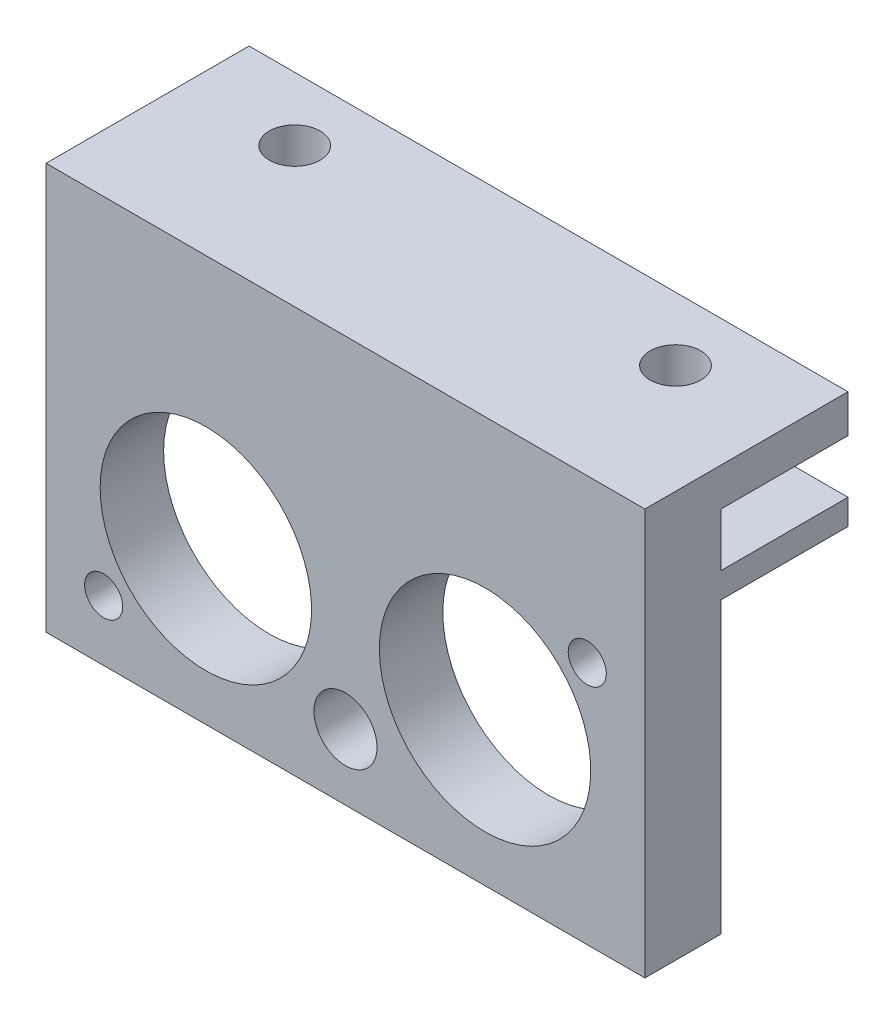
ISO-10303-21;
HEADER;
FILE_DESCRIPTION(('STEP AP214'),'2;1');
FILE_NAME('part.step','',(''),(''),'','','');
FILE_SCHEMA(('AUTOMOTIVE_DESIGN { 1 0 10303 214 1 1 1 1 }'));
ENDSEC;
DATA;
#1=APPLICATION_CONTEXT('core data for automotive mechanical design processes');
#2=APPLICATION_PROTOCOL_DEFINITION('international standard','automotive_design',2000,#1);
#3=PRODUCT_CONTEXT('',#1,'mechanical');
#4=PRODUCT('Part','Part','',(#3));
#5=PRODUCT_RELATED_PRODUCT_CATEGORY('part','',(#4));
#6=PRODUCT_DEFINITION_FORMATION('','',#4);
#7=PRODUCT_DEFINITION_CONTEXT('part definition',#1,'design');
#8=PRODUCT_DEFINITION('design','',#6,#7);
#9=PRODUCT_DEFINITION_SHAPE('','',#8);
#10=(LENGTH_UNIT() NAMED_UNIT(*) SI_UNIT(.MILLI.,.METRE.));
#11=(NAMED_UNIT(*) PLANE_ANGLE_UNIT() SI_UNIT($,.RADIAN.));
#12=(NAMED_UNIT(*) SI_UNIT($,.STERADIAN.) SOLID_ANGLE_UNIT());
#13=UNCERTAINTY_MEASURE_WITH_UNIT(LENGTH_MEASURE(1.E-05),#10,'distance_accuracy_value','');
#14=(GEOMETRIC_REPRESENTATION_CONTEXT(3) GLOBAL_UNCERTAINTY_ASSIGNED_CONTEXT((#13)) GLOBAL_UNIT_ASSIGNED_CONTEXT((#10,
#11,#12)) REPRESENTATION_CONTEXT('',''));
#15=CARTESIAN_POINT('',(0.,0.,0.));
#16=DIRECTION('',(0.,0.,1.));
#17=DIRECTION('',(1.,0.,0.));
#18=AXIS2_PLACEMENT_3D('',#15,#16,#17);
#19=CARTESIAN_POINT('',(-86.1189313630636,-26.6187031008466,2.482219341433E-13));
#20=DIRECTION('',(0.,0.,1.));
#21=DIRECTION('',(1.,0.,0.));
#22=AXIS2_PLACEMENT_3D('',#19,#20,#21);
#23=PLANE('',#22);
#24=DIRECTION('',(1.,0.,0.));
#25=VECTOR('',#24,1.);
#26=CARTESIAN_POINT('',(-88.1189313630636,-3.81870310084656,0.));
#27=LINE('',#26,#25);
#28=CARTESIAN_POINT('',(-54.5289313630636,-3.81870310084656,0.));
#29=VERTEX_POINT('',#28);
#30=CARTESIAN_POINT('',(-40.9389313630636,-3.81870310084656,2.48666185319545E-13));
#31=VERTEX_POINT('',#30);
#32=EDGE_CURVE('E365',#29,#31,#27,.T.);
#33=ORIENTED_EDGE('',*,*,#32,.F.);
#34=DIRECTION('',(0.,1.,0.));
#35=VECTOR('',#34,1.);
#36=CARTESIAN_POINT('',(-54.5289313630636,-26.6187031008466,2.482219341433E-13));
#37=LINE('',#36,#35);
#38=CARTESIAN_POINT('',(-54.5289313630636,0.381296899153442,0.));
#39=VERTEX_POINT('',#38);
#40=EDGE_CURVE('E460',#29,#39,#37,.T.);
#41=ORIENTED_EDGE('',*,*,#40,.T.);
#42=DIRECTION('',(-1.,0.,0.));
#43=VECTOR('',#42,1.);
#44=CARTESIAN_POINT('',(-40.9389313630636,0.381296899153443,0.));
#45=LINE('',#44,#43);
#46=CARTESIAN_POINT('',(-40.9389313630636,0.381296899153442,2.48666185319545E-13));
#47=VERTEX_POINT('',#46);
#48=EDGE_CURVE('E385',#47,#39,#45,.T.);
#49=ORIENTED_EDGE('',*,*,#48,.F.);
#50=DIRECTION('',(0.,-1.,0.));
#51=VECTOR('',#50,1.);
#52=CARTESIAN_POINT('',(-40.9389313630636,-28.6187031008466,2.48666185319545E-13));
#53=LINE('',#52,#51);
#54=EDGE_CURVE('E310',#47,#31,#53,.T.);
#55=ORIENTED_EDGE('',*,*,#54,.T.);
#56=EDGE_LOOP('',(#33,#41,#49,#55));
#57=FACE_BOUND('',#56,.T.);
#58=ADVANCED_FACE('F33',(#57),#23,.F.);
#59=CARTESIAN_POINT('',(-86.3189313630636,-6.41870310084656,-48.1183582429822));
#60=DIRECTION('',(0.,-1.,0.));
#61=DIRECTION('',(0.,0.,-1.));
#62=AXIS2_PLACEMENT_3D('',#59,#60,#61);
#63=PLANE('',#62);
#64=DIRECTION('',(0.,0.,1.));
#65=VECTOR('',#64,1.);
#66=CARTESIAN_POINT('',(-54.5289313630636,-6.41870310084656,1.00000000000025));
#67=LINE('',#66,#65);
#68=CARTESIAN_POINT('',(-54.5289313630636,-6.41870310084656,2.4980018054066E-13));
#69=VERTEX_POINT('',#68);
#70=CARTESIAN_POINT('',(-54.5289313630636,-6.41870310084656,1.00000000000025));
#71=VERTEX_POINT('',#70);
#72=EDGE_CURVE('E208',#69,#71,#67,.T.);
#73=ORIENTED_EDGE('',*,*,#72,.F.);
#74=DIRECTION('',(-1.,0.,0.));
#75=VECTOR('',#74,1.);
#76=CARTESIAN_POINT('',(-86.3189313630636,-6.41870310084656,2.48666185319545E-13));
#77=LINE('',#76,#75);
#78=CARTESIAN_POINT('',(-42.7389313630636,-6.41870310084656,2.48666185319545E-13));
#79=VERTEX_POINT('',#78);
#80=EDGE_CURVE('E410',#79,#69,#77,.T.);
#81=ORIENTED_EDGE('',*,*,#80,.F.);
#82=DIRECTION('',(0.,0.,1.));
#83=VECTOR('',#82,1.);
#84=CARTESIAN_POINT('',(-42.7389313630636,-6.41870310084656,-48.1183582429822));
#85=LINE('',#84,#83);
#86=CARTESIAN_POINT('',(-42.7389313630636,-6.41870310084656,1.00000000000025));
#87=VERTEX_POINT('',#86);
#88=EDGE_CURVE('E233',#79,#87,#85,.T.);
#89=ORIENTED_EDGE('',*,*,#88,.T.);
#90=DIRECTION('',(1.,0.,0.));
#91=VECTOR('',#90,1.);
#92=CARTESIAN_POINT('',(-86.3189313630636,-6.41870310084656,1.00000000000025));
#93=LINE('',#92,#91);
#94=EDGE_CURVE('E225',#71,#87,#93,.T.);
#95=ORIENTED_EDGE('',*,*,#94,.F.);
#96=EDGE_LOOP('',(#73,#81,#89,#95));
#97=FACE_BOUND('',#96,.T.);
#98=ADVANCED_FACE('F231',(#97),#63,.T.);
#99=CARTESIAN_POINT('',(-88.1189313630636,-3.81870310084656,-10.));
#100=DIRECTION('',(0.,-1.,0.));
#101=DIRECTION('',(1.,0.,0.));
#102=AXIS2_PLACEMENT_3D('',#99,#100,#101);
#103=PLANE('',#102);
#104=CARTESIAN_POINT('',(-49.5289313630636,-3.81870310084656,-4.99999999999999));
#105=DIRECTION('',(0.,-1.,0.));
#106=DIRECTION('',(1.,0.,0.));
#107=AXIS2_PLACEMENT_3D('',#104,#105,#106);
#108=CIRCLE('',#107,2.);
#109=CARTESIAN_POINT('',(-47.5289313630636,-3.81870310084656,-4.99999999999999));
#110=VERTEX_POINT('',#109);
#111=EDGE_CURVE('E479',#110,#110,#108,.T.);
#112=ORIENTED_EDGE('',*,*,#111,.T.);
#113=EDGE_LOOP('',(#112));
#114=FACE_BOUND('',#113,.T.);
#115=DIRECTION('',(1.,0.,0.));
#116=VECTOR('',#115,1.);
#117=CARTESIAN_POINT('',(-88.1189313630636,-3.81870310084656,-10.));
#118=LINE('',#117,#116);
#119=CARTESIAN_POINT('',(-54.5289313630636,-3.81870310084655,-9.99999999999999));
#120=VERTEX_POINT('',#119);
#121=CARTESIAN_POINT('',(-40.9389313630636,-3.81870310084656,-10.));
#122=VERTEX_POINT('',#121);
#123=EDGE_CURVE('E487',#120,#122,#118,.T.);
#124=ORIENTED_EDGE('',*,*,#123,.F.);
#125=DIRECTION('',(0.,0.,1.));
#126=VECTOR('',#125,1.);
#127=CARTESIAN_POINT('',(-54.5289313630636,-3.81870310084656,-10.));
#128=LINE('',#127,#126);
#129=EDGE_CURVE('E457',#120,#29,#128,.T.);
#130=ORIENTED_EDGE('',*,*,#129,.T.);
#131=ORIENTED_EDGE('',*,*,#32,.T.);
#132=DIRECTION('',(0.,0.,1.));
#133=VECTOR('',#132,1.);
#134=CARTESIAN_POINT('',(-40.9389313630636,-3.81870310084656,-10.));
#135=LINE('',#134,#133);
#136=EDGE_CURVE('E374',#122,#31,#135,.T.);
#137=ORIENTED_EDGE('',*,*,#136,.F.);
#138=EDGE_LOOP('',(#124,#130,#131,#137));
#139=FACE_BOUND('',#138,.T.);
#140=ADVANCED_FACE('F495',(#114,#139),#103,.F.);
#141=CARTESIAN_POINT('',(-88.1189313630636,-5.81870310084656,-10.));
#142=DIRECTION('',(0.,1.,0.));
#143=DIRECTION('',(-1.,0.,0.));
#144=AXIS2_PLACEMENT_3D('',#141,#142,#143);
#145=PLANE('',#144);
#146=CARTESIAN_POINT('',(-49.5289313630636,-5.81870310084656,-4.99999999999999));
#147=DIRECTION('',(0.,-1.,0.));
#148=DIRECTION('',(1.,0.,0.));
#149=AXIS2_PLACEMENT_3D('',#146,#147,#148);
#150=CIRCLE('',#149,2.);
#151=CARTESIAN_POINT('',(-47.5289313630636,-5.81870310084656,-4.99999999999999));
#152=VERTEX_POINT('',#151);
#153=EDGE_CURVE('E475',#152,#152,#150,.T.);
#154=ORIENTED_EDGE('',*,*,#153,.F.);
#155=EDGE_LOOP('',(#154));
#156=FACE_BOUND('',#155,.T.);
#157=DIRECTION('',(-1.,0.,0.));
#158=VECTOR('',#157,1.);
#159=CARTESIAN_POINT('',(-88.1189313630636,-5.81870310084656,0.));
#160=LINE('',#159,#158);
#161=CARTESIAN_POINT('',(-40.9389313630636,-5.81870310084656,0.));
#162=VERTEX_POINT('',#161);
#163=CARTESIAN_POINT('',(-54.5289313630636,-5.81870310084656,0.));
#164=VERTEX_POINT('',#163);
#165=EDGE_CURVE('E366',#162,#164,#160,.T.);
#166=ORIENTED_EDGE('',*,*,#165,.T.);
#167=DIRECTION('',(0.,0.,-1.));
#168=VECTOR('',#167,1.);
#169=CARTESIAN_POINT('',(-54.5289313630636,-5.81870310084656,-10.));
#170=LINE('',#169,#168);
#171=CARTESIAN_POINT('',(-54.5289313630636,-5.81870310084655,-9.99999999999999));
#172=VERTEX_POINT('',#171);
#173=EDGE_CURVE('E453',#164,#172,#170,.T.);
#174=ORIENTED_EDGE('',*,*,#173,.T.);
#175=DIRECTION('',(-1.,0.,0.));
#176=VECTOR('',#175,1.);
#177=CARTESIAN_POINT('',(-88.1189313630636,-5.81870310084656,-10.));
#178=LINE('',#177,#176);
#179=CARTESIAN_POINT('',(-40.9389313630636,-5.81870310084656,-10.));
#180=VERTEX_POINT('',#179);
#181=EDGE_CURVE('E356',#180,#172,#178,.T.);
#182=ORIENTED_EDGE('',*,*,#181,.F.);
#183=DIRECTION('',(0.,0.,1.));
#184=VECTOR('',#183,1.);
#185=CARTESIAN_POINT('',(-40.9389313630636,-5.81870310084656,-10.));
#186=LINE('',#185,#184);
#187=EDGE_CURVE('E371',#180,#162,#186,.T.);
#188=ORIENTED_EDGE('',*,*,#187,.T.);
#189=EDGE_LOOP('',(#166,#174,#182,#188));
#190=FACE_BOUND('',#189,.T.);
#191=ADVANCED_FACE('F504',(#156,#190),#145,.F.);
#192=CARTESIAN_POINT('',(0.,0.,-10.));
#193=DIRECTION('',(0.,0.,1.));
#194=DIRECTION('',(1.,0.,0.));
#195=AXIS2_PLACEMENT_3D('',#192,#193,#194);
#196=PLANE('',#195);
#197=ORIENTED_EDGE('',*,*,#181,.T.);
#198=DIRECTION('',(0.,1.,0.));
#199=VECTOR('',#198,1.);
#200=CARTESIAN_POINT('',(-54.5289313630636,0.,-10.));
#201=LINE('',#200,#199);
#202=EDGE_CURVE('E11',#172,#120,#201,.T.);
#203=ORIENTED_EDGE('',*,*,#202,.T.);
#204=ORIENTED_EDGE('',*,*,#123,.T.);
#205=DIRECTION('',(0.,-1.,0.));
#206=VECTOR('',#205,1.);
#207=CARTESIAN_POINT('',(-40.9389313630636,-3.81870310084656,-10.));
#208=LINE('',#207,#206);
#209=EDGE_CURVE('E357',#122,#180,#208,.T.);
#210=ORIENTED_EDGE('',*,*,#209,.T.);
#211=EDGE_LOOP('',(#197,#203,#204,#210));
#212=FACE_BOUND('',#211,.T.);
#213=ADVANCED_FACE('F491',(#212),#196,.F.);
#214=CARTESIAN_POINT('',(-74.5289313630636,0.381296899153442,0.));
#215=VERTEX_POINT('',#214);
#216=CARTESIAN_POINT('',(-88.1189313630636,0.381296899153442,0.));
#217=VERTEX_POINT('',#216);
#218=EDGE_CURVE('E380',#215,#217,#45,.T.);
#219=ORIENTED_EDGE('',*,*,#218,.F.);
#220=DIRECTION('',(0.,-1.,0.));
#221=VECTOR('',#220,1.);
#222=CARTESIAN_POINT('',(-74.5289313630636,-26.6187031008466,2.482219341433E-13));
#223=LINE('',#222,#221);
#224=CARTESIAN_POINT('',(-74.5289313630636,-3.81870310084656,0.));
#225=VERTEX_POINT('',#224);
#226=EDGE_CURVE('E451',#215,#225,#223,.T.);
#227=ORIENTED_EDGE('',*,*,#226,.T.);
#228=CARTESIAN_POINT('',(-88.1189313630636,-3.81870310084656,2.48666185319545E-13));
#229=VERTEX_POINT('',#228);
#230=EDGE_CURVE('E56',#229,#225,#27,.T.);
#231=ORIENTED_EDGE('',*,*,#230,.F.);
#232=DIRECTION('',(0.,1.,0.));
#233=VECTOR('',#232,1.);
#234=CARTESIAN_POINT('',(-88.1189313630636,-28.6187031008466,2.48666185319545E-13));
#235=LINE('',#234,#233);
#236=EDGE_CURVE('E313',#229,#217,#235,.T.);
#237=ORIENTED_EDGE('',*,*,#236,.T.);
#238=EDGE_LOOP('',(#219,#227,#231,#237));
#239=FACE_BOUND('',#238,.T.);
#240=ADVANCED_FACE('F520',(#239),#23,.F.);
#241=ORIENTED_EDGE('',*,*,#80,.T.);
#242=DIRECTION('',(0.,1.,0.));
#243=VECTOR('',#242,1.);
#244=CARTESIAN_POINT('',(-54.5289313630636,-26.6187031008466,2.482219341433E-13));
#245=LINE('',#244,#243);
#246=EDGE_CURVE('E213',#69,#164,#245,.T.);
#247=ORIENTED_EDGE('',*,*,#246,.T.);
#248=ORIENTED_EDGE('',*,*,#165,.F.);
#249=CARTESIAN_POINT('',(-40.9389313630636,-28.6187031008466,2.3478839751173E-13));
#250=VERTEX_POINT('',#249);
#251=EDGE_CURVE('E314',#162,#250,#53,.T.);
#252=ORIENTED_EDGE('',*,*,#251,.T.);
#253=DIRECTION('',(-1.,0.,0.));
#254=VECTOR('',#253,1.);
#255=CARTESIAN_POINT('',(-88.1189313630636,-28.6187031008466,2.48666185319545E-13));
#256=LINE('',#255,#254);
#257=CARTESIAN_POINT('',(-88.1189313630636,-28.6187031008466,2.48666185319545E-13));
#258=VERTEX_POINT('',#257);
#259=EDGE_CURVE('E318',#250,#258,#256,.T.);
#260=ORIENTED_EDGE('',*,*,#259,.T.);
#261=CARTESIAN_POINT('',(-88.1189313630636,-5.81870310084656,2.48666185319545E-13));
#262=VERTEX_POINT('',#261);
#263=EDGE_CURVE('E315',#258,#262,#235,.T.);
#264=ORIENTED_EDGE('',*,*,#263,.T.);
#265=CARTESIAN_POINT('',(-74.5289313630636,-5.81870310084656,0.));
#266=VERTEX_POINT('',#265);
#267=EDGE_CURVE('E364',#266,#262,#160,.T.);
#268=ORIENTED_EDGE('',*,*,#267,.F.);
#269=DIRECTION('',(0.,-1.,0.));
#270=VECTOR('',#269,1.);
#271=CARTESIAN_POINT('',(-74.5289313630636,-26.6187031008466,2.482219341433E-13));
#272=LINE('',#271,#270);
#273=CARTESIAN_POINT('',(-74.5289313630636,-6.41870310084656,2.4980018054066E-13));
#274=VERTEX_POINT('',#273);
#275=EDGE_CURVE('E446',#266,#274,#272,.T.);
#276=ORIENTED_EDGE('',*,*,#275,.T.);
#277=CARTESIAN_POINT('',(-86.3189313630636,-6.41870310084656,2.48666185319545E-13));
#278=VERTEX_POINT('',#277);
#279=EDGE_CURVE('E256',#274,#278,#77,.T.);
#280=ORIENTED_EDGE('',*,*,#279,.T.);
#281=DIRECTION('',(0.,-1.,0.));
#282=VECTOR('',#281,1.);
#283=CARTESIAN_POINT('',(-86.3189313630636,-26.8187031008466,2.48666185319545E-13));
#284=LINE('',#283,#282);
#285=CARTESIAN_POINT('',(-86.3189313630636,-26.8187031008466,2.48666185319545E-13));
#286=VERTEX_POINT('',#285);
#287=EDGE_CURVE('E412',#278,#286,#284,.T.);
#288=ORIENTED_EDGE('',*,*,#287,.T.);
#289=DIRECTION('',(1.,0.,0.));
#290=VECTOR('',#289,1.);
#291=CARTESIAN_POINT('',(-42.7389313630636,-26.8187031008466,2.48666185319545E-13));
#292=LINE('',#291,#290);
#293=CARTESIAN_POINT('',(-42.7389313630636,-26.8187031008466,2.482219341433E-13));
#294=VERTEX_POINT('',#293);
#295=EDGE_CURVE('E269',#286,#294,#292,.T.);
#296=ORIENTED_EDGE('',*,*,#295,.T.);
#297=DIRECTION('',(0.,1.,0.));
#298=VECTOR('',#297,1.);
#299=CARTESIAN_POINT('',(-42.7389313630636,-6.41870310084656,2.48666185319545E-13));
#300=LINE('',#299,#298);
#301=EDGE_CURVE('E253',#294,#79,#300,.T.);
#302=ORIENTED_EDGE('',*,*,#301,.T.);
#303=EDGE_LOOP('',(#241,#247,#248,#252,#260,#264,#268,#276,#280,#288,#296,#302));
#304=FACE_BOUND('',#303,.T.);
#305=ADVANCED_FACE('F506',(#304),#23,.F.);
#306=CARTESIAN_POINT('',(-45.4789313630636,-9.37970310084656,6.00000000000025));
#307=DIRECTION('',(0.,0.,-1.));
#308=DIRECTION('',(-1.,0.,0.));
#309=AXIS2_PLACEMENT_3D('',#306,#307,#308);
#310=CYLINDRICAL_SURFACE('',#309,1.5);
#311=CARTESIAN_POINT('',(-45.4789313630636,-9.37970310084656,6.00000000000025));
#312=DIRECTION('',(0.,0.,-1.));
#313=DIRECTION('',(-1.,0.,0.));
#314=AXIS2_PLACEMENT_3D('',#311,#312,#313);
#315=CIRCLE('',#314,1.5);
#316=CARTESIAN_POINT('',(-46.9789313630636,-9.37970310084656,6.00000000000025));
#317=VERTEX_POINT('',#316);
#318=EDGE_CURVE('E299',#317,#317,#315,.T.);
#319=ORIENTED_EDGE('',*,*,#318,.F.);
#320=EDGE_LOOP('',(#319));
#321=FACE_BOUND('',#320,.T.);
#322=CARTESIAN_POINT('',(-45.4789313630636,-9.37970310084656,1.00000000000025));
#323=DIRECTION('',(0.,0.,-1.));
#324=DIRECTION('',(-1.,0.,0.));
#325=AXIS2_PLACEMENT_3D('',#322,#323,#324);
#326=CIRCLE('',#325,1.5);
#327=CARTESIAN_POINT('',(-46.9789313630636,-9.37970310084656,1.00000000000025));
#328=VERTEX_POINT('',#327);
#329=EDGE_CURVE('E290',#328,#328,#326,.F.);
#330=ORIENTED_EDGE('',*,*,#329,.F.);
#331=EDGE_LOOP('',(#330));
#332=FACE_BOUND('',#331,.T.);
#333=ADVANCED_FACE('F528',(#321,#332),#310,.F.);
#334=CARTESIAN_POINT('',(-83.5789313630636,-23.8577031008466,6.00000000000025));
#335=DIRECTION('',(0.,0.,-1.));
#336=DIRECTION('',(-1.,0.,0.));
#337=AXIS2_PLACEMENT_3D('',#334,#335,#336);
#338=CYLINDRICAL_SURFACE('',#337,1.5);
#339=CARTESIAN_POINT('',(-83.5789313630636,-23.8577031008466,6.00000000000025));
#340=DIRECTION('',(0.,0.,-1.));
#341=DIRECTION('',(-1.,0.,0.));
#342=AXIS2_PLACEMENT_3D('',#339,#340,#341);
#343=CIRCLE('',#342,1.5);
#344=CARTESIAN_POINT('',(-85.0789313630636,-23.8577031008466,6.00000000000025));
#345=VERTEX_POINT('',#344);
#346=EDGE_CURVE('E305',#345,#345,#343,.T.);
#347=ORIENTED_EDGE('',*,*,#346,.F.);
#348=EDGE_LOOP('',(#347));
#349=FACE_BOUND('',#348,.T.);
#350=CARTESIAN_POINT('',(-83.5789313630636,-23.8577031008466,1.00000000000025));
#351=DIRECTION('',(0.,0.,-1.));
#352=DIRECTION('',(-1.,0.,0.));
#353=AXIS2_PLACEMENT_3D('',#350,#351,#352);
#354=CIRCLE('',#353,1.5);
#355=CARTESIAN_POINT('',(-85.0789313630636,-23.8577031008466,1.00000000000025));
#356=VERTEX_POINT('',#355);
#357=EDGE_CURVE('E298',#356,#356,#354,.F.);
#358=ORIENTED_EDGE('',*,*,#357,.F.);
#359=EDGE_LOOP('',(#358));
#360=FACE_BOUND('',#359,.T.);
#361=ADVANCED_FACE('F639',(#349,#360),#338,.F.);
#362=CARTESIAN_POINT('',(-88.1189313630636,-28.6187031008466,-52.9334714523804));
#363=DIRECTION('',(-1.,0.,0.));
#364=DIRECTION('',(0.,0.,1.));
#365=AXIS2_PLACEMENT_3D('',#362,#363,#364);
#366=PLANE('',#365);
#367=ORIENTED_EDGE('',*,*,#263,.F.);
#368=DIRECTION('',(0.,0.,1.));
#369=VECTOR('',#368,1.);
#370=CARTESIAN_POINT('',(-88.1189313630636,-28.6187031008466,-52.9334714523804));
#371=LINE('',#370,#369);
#372=CARTESIAN_POINT('',(-88.1189313630636,-28.6187031008466,6.00000000000025));
#373=VERTEX_POINT('',#372);
#374=EDGE_CURVE('E326',#258,#373,#371,.T.);
#375=ORIENTED_EDGE('',*,*,#374,.T.);
#376=DIRECTION('',(0.,-1.,0.));
#377=VECTOR('',#376,1.);
#378=CARTESIAN_POINT('',(-88.1189313630636,-28.6187031008466,6.00000000000025));
#379=LINE('',#378,#377);
#380=CARTESIAN_POINT('',(-88.1189313630636,3.38129689915344,6.00000000000025));
#381=VERTEX_POINT('',#380);
#382=EDGE_CURVE('E308',#381,#373,#379,.T.);
#383=ORIENTED_EDGE('',*,*,#382,.F.);
#384=DIRECTION('',(0.,0.,1.));
#385=VECTOR('',#384,1.);
#386=CARTESIAN_POINT('',(-88.1189313630636,3.38129689915344,-47.8534471067652));
#387=LINE('',#386,#385);
#388=CARTESIAN_POINT('',(-88.1189313630636,3.38129689915344,-10.));
#389=VERTEX_POINT('',#388);
#390=EDGE_CURVE('E405',#389,#381,#387,.T.);
#391=ORIENTED_EDGE('',*,*,#390,.F.);
#392=DIRECTION('',(0.,1.,0.));
#393=VECTOR('',#392,1.);
#394=CARTESIAN_POINT('',(-88.1189313630636,3.38129689915344,-10.));
#395=LINE('',#394,#393);
#396=CARTESIAN_POINT('',(-88.1189313630636,0.381296899153442,-10.));
#397=VERTEX_POINT('',#396);
#398=EDGE_CURVE('E387',#397,#389,#395,.T.);
#399=ORIENTED_EDGE('',*,*,#398,.F.);
#400=DIRECTION('',(0.,0.,1.));
#401=VECTOR('',#400,1.);
#402=CARTESIAN_POINT('',(-88.1189313630636,0.381296899153442,-10.));
#403=LINE('',#402,#401);
#404=EDGE_CURVE('E393',#397,#217,#403,.T.);
#405=ORIENTED_EDGE('',*,*,#404,.T.);
#406=ORIENTED_EDGE('',*,*,#236,.F.);
#407=DIRECTION('',(0.,0.,1.));
#408=VECTOR('',#407,1.);
#409=CARTESIAN_POINT('',(-88.1189313630636,-3.81870310084656,-10.));
#410=LINE('',#409,#408);
#411=CARTESIAN_POINT('',(-88.1189313630636,-3.81870310084656,-10.));
#412=VERTEX_POINT('',#411);
#413=EDGE_CURVE('E377',#412,#229,#410,.T.);
#414=ORIENTED_EDGE('',*,*,#413,.F.);
#415=DIRECTION('',(0.,1.,0.));
#416=VECTOR('',#415,1.);
#417=CARTESIAN_POINT('',(-88.1189313630636,-3.81870310084656,-10.));
#418=LINE('',#417,#416);
#419=CARTESIAN_POINT('',(-88.1189313630636,-5.81870310084656,-10.));
#420=VERTEX_POINT('',#419);
#421=EDGE_CURVE('E369',#420,#412,#418,.T.);
#422=ORIENTED_EDGE('',*,*,#421,.F.);
#423=DIRECTION('',(0.,0.,1.));
#424=VECTOR('',#423,1.);
#425=CARTESIAN_POINT('',(-88.1189313630636,-5.81870310084656,-10.));
#426=LINE('',#425,#424);
#427=EDGE_CURVE('E354',#420,#262,#426,.T.);
#428=ORIENTED_EDGE('',*,*,#427,.T.);
#429=EDGE_LOOP('',(#367,#375,#383,#391,#399,#405,#406,#414,#422,#428));
#430=FACE_BOUND('',#429,.T.);
#431=ADVANCED_FACE('F35',(#430),#366,.T.);
#432=CARTESIAN_POINT('',(-40.9389313630636,-28.6187031008466,-52.9334714523804));
#433=DIRECTION('',(1.,0.,0.));
#434=DIRECTION('',(0.,0.,-1.));
#435=AXIS2_PLACEMENT_3D('',#432,#433,#434);
#436=PLANE('',#435);
#437=ORIENTED_EDGE('',*,*,#54,.F.);
#438=DIRECTION('',(0.,0.,1.));
#439=VECTOR('',#438,1.);
#440=CARTESIAN_POINT('',(-40.9389313630636,0.381296899153443,-10.));
#441=LINE('',#440,#439);
#442=CARTESIAN_POINT('',(-40.9389313630636,0.381296899153443,-10.));
#443=VERTEX_POINT('',#442);
#444=EDGE_CURVE('E398',#443,#47,#441,.T.);
#445=ORIENTED_EDGE('',*,*,#444,.F.);
#446=DIRECTION('',(0.,-1.,0.));
#447=VECTOR('',#446,1.);
#448=CARTESIAN_POINT('',(-40.9389313630636,3.38129689915344,-10.));
#449=LINE('',#448,#447);
#450=CARTESIAN_POINT('',(-40.9389313630636,3.38129689915344,-10.));
#451=VERTEX_POINT('',#450);
#452=EDGE_CURVE('E381',#451,#443,#449,.T.);
#453=ORIENTED_EDGE('',*,*,#452,.F.);
#454=DIRECTION('',(0.,0.,1.));
#455=VECTOR('',#454,1.);
#456=CARTESIAN_POINT('',(-40.9389313630636,3.38129689915344,-47.8534471067652));
#457=LINE('',#456,#455);
#458=CARTESIAN_POINT('',(-40.9389313630636,3.38129689915344,6.00000000000025));
#459=VERTEX_POINT('',#458);
#460=EDGE_CURVE('E404',#451,#459,#457,.T.);
#461=ORIENTED_EDGE('',*,*,#460,.T.);
#462=DIRECTION('',(0.,1.,0.));
#463=VECTOR('',#462,1.);
#464=CARTESIAN_POINT('',(-40.9389313630636,-28.6187031008466,6.00000000000025));
#465=LINE('',#464,#463);
#466=CARTESIAN_POINT('',(-40.9389313630636,-28.6187031008466,6.00000000000025));
#467=VERTEX_POINT('',#466);
#468=EDGE_CURVE('E324',#467,#459,#465,.T.);
#469=ORIENTED_EDGE('',*,*,#468,.F.);
#470=DIRECTION('',(0.,0.,1.));
#471=VECTOR('',#470,1.);
#472=CARTESIAN_POINT('',(-40.9389313630636,-28.6187031008466,-52.9334714523804));
#473=LINE('',#472,#471);
#474=EDGE_CURVE('E327',#250,#467,#473,.T.);
#475=ORIENTED_EDGE('',*,*,#474,.F.);
#476=ORIENTED_EDGE('',*,*,#251,.F.);
#477=ORIENTED_EDGE('',*,*,#187,.F.);
#478=ORIENTED_EDGE('',*,*,#209,.F.);
#479=ORIENTED_EDGE('',*,*,#136,.T.);
#480=EDGE_LOOP('',(#437,#445,#453,#461,#469,#475,#476,#477,#478,#479));
#481=FACE_BOUND('',#480,.T.);
#482=ADVANCED_FACE('F499',(#481),#436,.T.);
#483=CARTESIAN_POINT('',(-88.1189313630636,-28.6187031008466,-52.9334714523804));
#484=DIRECTION('',(0.,-1.,0.));
#485=DIRECTION('',(0.,0.,-1.));
#486=AXIS2_PLACEMENT_3D('',#483,#484,#485);
#487=PLANE('',#486);
#488=ORIENTED_EDGE('',*,*,#259,.F.);
#489=ORIENTED_EDGE('',*,*,#474,.T.);
#490=DIRECTION('',(1.,0.,0.));
#491=VECTOR('',#490,1.);
#492=CARTESIAN_POINT('',(-88.1189313630636,-28.6187031008466,6.00000000000025));
#493=LINE('',#492,#491);
#494=EDGE_CURVE('E321',#373,#467,#493,.T.);
#495=ORIENTED_EDGE('',*,*,#494,.F.);
#496=ORIENTED_EDGE('',*,*,#374,.F.);
#497=EDGE_LOOP('',(#488,#489,#495,#496));
#498=FACE_BOUND('',#497,.T.);
#499=ADVANCED_FACE('F552',(#498),#487,.T.);
#500=CARTESIAN_POINT('',(-13.7204387637204,-5.79974003466205,6.00000000000025));
#501=DIRECTION('',(0.,0.,-1.));
#502=DIRECTION('',(-1.,0.,0.));
#503=AXIS2_PLACEMENT_3D('',#500,#501,#502);
#504=PLANE('',#503);
#505=CARTESIAN_POINT('',(-53.5299558776943,-16.6187031008466,6.00000000000025));
#506=DIRECTION('',(0.,0.,-1.));
#507=DIRECTION('',(-1.,0.,0.));
#508=AXIS2_PLACEMENT_3D('',#505,#506,#507);
#509=CIRCLE('',#508,8.328);
#510=CARTESIAN_POINT('',(-61.8579558776943,-16.6187031008466,6.00000000000025));
#511=VERTEX_POINT('',#510);
#512=EDGE_CURVE('E295',#511,#511,#509,.T.);
#513=ORIENTED_EDGE('',*,*,#512,.T.);
#514=EDGE_LOOP('',(#513));
#515=FACE_BOUND('',#514,.T.);
#516=CARTESIAN_POINT('',(-75.5279068484328,-16.6187031008466,6.00000000000025));
#517=DIRECTION('',(0.,0.,-1.));
#518=DIRECTION('',(-1.,0.,0.));
#519=AXIS2_PLACEMENT_3D('',#516,#517,#518);
#520=CIRCLE('',#519,8.328);
#521=CARTESIAN_POINT('',(-83.8559068484329,-16.6187031008466,6.00000000000025));
#522=VERTEX_POINT('',#521);
#523=EDGE_CURVE('E291',#522,#522,#520,.T.);
#524=ORIENTED_EDGE('',*,*,#523,.T.);
#525=EDGE_LOOP('',(#524));
#526=FACE_BOUND('',#525,.T.);
#527=CARTESIAN_POINT('',(-64.5289313630636,-23.4411931487829,6.00000000000025));
#528=DIRECTION('',(0.,0.,-1.));
#529=DIRECTION('',(-1.,0.,0.));
#530=AXIS2_PLACEMENT_3D('',#527,#528,#529);
#531=CIRCLE('',#530,2.486);
#532=CARTESIAN_POINT('',(-67.0149313630636,-23.4411931487829,6.00000000000025));
#533=VERTEX_POINT('',#532);
#534=EDGE_CURVE('E294',#533,#533,#531,.T.);
#535=ORIENTED_EDGE('',*,*,#534,.T.);
#536=EDGE_LOOP('',(#535));
#537=FACE_BOUND('',#536,.T.);
#538=ORIENTED_EDGE('',*,*,#318,.T.);
#539=EDGE_LOOP('',(#538));
#540=FACE_BOUND('',#539,.T.);
#541=ORIENTED_EDGE('',*,*,#346,.T.);
#542=EDGE_LOOP('',(#541));
#543=FACE_BOUND('',#542,.T.);
#544=ORIENTED_EDGE('',*,*,#382,.T.);
#545=ORIENTED_EDGE('',*,*,#494,.T.);
#546=ORIENTED_EDGE('',*,*,#468,.T.);
#547=DIRECTION('',(-1.,0.,0.));
#548=VECTOR('',#547,1.);
#549=CARTESIAN_POINT('',(-88.1189313630636,3.38129689915344,6.00000000000025));
#550=LINE('',#549,#548);
#551=EDGE_CURVE('E401',#459,#381,#550,.T.);
#552=ORIENTED_EDGE('',*,*,#551,.T.);
#553=EDGE_LOOP('',(#544,#545,#546,#552));
#554=FACE_BOUND('',#553,.T.);
#555=ADVANCED_FACE('F549',(#515,#526,#537,#540,#543,#554),#504,.F.);
#556=CARTESIAN_POINT('',(-86.1189313630636,-26.6187031008466,1.00000000000025));
#557=DIRECTION('',(0.,0.,1.));
#558=DIRECTION('',(1.,0.,0.));
#559=AXIS2_PLACEMENT_3D('',#556,#557,#558);
#560=PLANE('',#559);
#561=DIRECTION('',(0.,-1.,0.));
#562=VECTOR('',#561,1.);
#563=CARTESIAN_POINT('',(-58.4489313630636,-8.95390140454284,1.00000000000025));
#564=LINE('',#563,#562);
#565=CARTESIAN_POINT('',(-58.4489313630636,-6.95390140454284,1.00000000000025));
#566=VERTEX_POINT('',#565);
#567=CARTESIAN_POINT('',(-58.4489313630636,-8.95390140454284,1.00000000000025));
#568=VERTEX_POINT('',#567);
#569=EDGE_CURVE('E260',#566,#568,#564,.T.);
#570=ORIENTED_EDGE('',*,*,#569,.F.);
#571=DIRECTION('',(1.,0.,0.));
#572=VECTOR('',#571,1.);
#573=CARTESIAN_POINT('',(-70.6089313630636,-6.95390140454284,1.00000000000025));
#574=LINE('',#573,#572);
#575=CARTESIAN_POINT('',(-70.6089313630636,-6.95390140454284,1.00000000000025));
#576=VERTEX_POINT('',#575);
#577=EDGE_CURVE('E263',#576,#566,#574,.T.);
#578=ORIENTED_EDGE('',*,*,#577,.F.);
#579=DIRECTION('',(0.,1.,0.));
#580=VECTOR('',#579,1.);
#581=CARTESIAN_POINT('',(-70.6089313630636,-8.95390140454284,1.00000000000025));
#582=LINE('',#581,#580);
#583=CARTESIAN_POINT('',(-70.6089313630636,-8.95390140454284,1.00000000000025));
#584=VERTEX_POINT('',#583);
#585=EDGE_CURVE('E266',#584,#576,#582,.T.);
#586=ORIENTED_EDGE('',*,*,#585,.F.);
#587=DIRECTION('',(-1.,0.,0.));
#588=VECTOR('',#587,1.);
#589=CARTESIAN_POINT('',(-70.6089313630636,-8.95390140454284,1.00000000000025));
#590=LINE('',#589,#588);
#591=EDGE_CURVE('E257',#568,#584,#590,.T.);
#592=ORIENTED_EDGE('',*,*,#591,.F.);
#593=EDGE_LOOP('',(#570,#578,#586,#592));
#594=FACE_BOUND('',#593,.T.);
#595=CARTESIAN_POINT('',(-53.5299558776943,-16.6187031008466,1.00000000000025));
#596=DIRECTION('',(0.,0.,1.));
#597=DIRECTION('',(1.,0.,0.));
#598=AXIS2_PLACEMENT_3D('',#595,#596,#597);
#599=CIRCLE('',#598,8.328);
#600=CARTESIAN_POINT('',(-45.2019558776943,-16.6187031008466,1.00000000000025));
#601=VERTEX_POINT('',#600);
#602=EDGE_CURVE('E309',#601,#601,#599,.T.);
#603=ORIENTED_EDGE('',*,*,#602,.T.);
#604=EDGE_LOOP('',(#603));
#605=FACE_BOUND('',#604,.T.);
#606=CARTESIAN_POINT('',(-75.5279068484328,-16.6187031008466,1.00000000000025));
#607=DIRECTION('',(0.,0.,1.));
#608=DIRECTION('',(1.,0.,0.));
#609=AXIS2_PLACEMENT_3D('',#606,#607,#608);
#610=CIRCLE('',#609,8.328);
#611=CARTESIAN_POINT('',(-67.1999068484328,-16.6187031008466,1.00000000000025));
#612=VERTEX_POINT('',#611);
#613=EDGE_CURVE('E333',#612,#612,#610,.T.);
#614=ORIENTED_EDGE('',*,*,#613,.T.);
#615=EDGE_LOOP('',(#614));
#616=FACE_BOUND('',#615,.T.);
#617=CARTESIAN_POINT('',(-64.5289313630636,-23.4411931487829,1.00000000000025));
#618=DIRECTION('',(0.,0.,1.));
#619=DIRECTION('',(1.,0.,0.));
#620=AXIS2_PLACEMENT_3D('',#617,#618,#619);
#621=CIRCLE('',#620,2.486);
#622=CARTESIAN_POINT('',(-62.0429313630636,-23.4411931487829,1.00000000000025));
#623=VERTEX_POINT('',#622);
#624=EDGE_CURVE('E302',#623,#623,#621,.T.);
#625=ORIENTED_EDGE('',*,*,#624,.T.);
#626=EDGE_LOOP('',(#625));
#627=FACE_BOUND('',#626,.T.);
#628=ORIENTED_EDGE('',*,*,#357,.T.);
#629=EDGE_LOOP('',(#628));
#630=FACE_BOUND('',#629,.T.);
#631=ORIENTED_EDGE('',*,*,#329,.T.);
#632=EDGE_LOOP('',(#631));
#633=FACE_BOUND('',#632,.T.);
#634=DIRECTION('',(-1.,0.,0.));
#635=VECTOR('',#634,1.);
#636=CARTESIAN_POINT('',(-42.7389313630636,-26.8187031008466,1.00000000000025));
#637=LINE('',#636,#635);
#638=CARTESIAN_POINT('',(-42.7389313630636,-26.8187031008466,1.00000000000025));
#639=VERTEX_POINT('',#638);
#640=CARTESIAN_POINT('',(-86.3189313630636,-26.8187031008466,1.00000000000025));
#641=VERTEX_POINT('',#640);
#642=EDGE_CURVE('E241',#639,#641,#637,.T.);
#643=ORIENTED_EDGE('',*,*,#642,.T.);
#644=DIRECTION('',(0.,1.,0.));
#645=VECTOR('',#644,1.);
#646=CARTESIAN_POINT('',(-86.3189313630636,-26.8187031008466,1.00000000000025));
#647=LINE('',#646,#645);
#648=CARTESIAN_POINT('',(-86.3189313630636,-6.41870310084656,1.00000000000025));
#649=VERTEX_POINT('',#648);
#650=EDGE_CURVE('E236',#641,#649,#647,.T.);
#651=ORIENTED_EDGE('',*,*,#650,.T.);
#652=CARTESIAN_POINT('',(-74.5289313630636,-6.41870310084656,1.00000000000025));
#653=VERTEX_POINT('',#652);
#654=EDGE_CURVE('E235',#649,#653,#93,.T.);
#655=ORIENTED_EDGE('',*,*,#654,.T.);
#656=DIRECTION('',(0.,-1.,0.));
#657=VECTOR('',#656,1.);
#658=CARTESIAN_POINT('',(-74.5289313630636,23.2067213201802,1.00000000000025));
#659=LINE('',#658,#657);
#660=CARTESIAN_POINT('',(-74.5289313630636,0.381296899153442,1.00000000000025));
#661=VERTEX_POINT('',#660);
#662=EDGE_CURVE('E431',#661,#653,#659,.T.);
#663=ORIENTED_EDGE('',*,*,#662,.F.);
#664=DIRECTION('',(-1.,0.,0.));
#665=VECTOR('',#664,1.);
#666=CARTESIAN_POINT('',(-74.5289313630636,0.381296899153442,1.00000000000025));
#667=LINE('',#666,#665);
#668=CARTESIAN_POINT('',(-54.5289313630636,0.381296899153442,1.00000000000025));
#669=VERTEX_POINT('',#668);
#670=EDGE_CURVE('E229',#669,#661,#667,.T.);
#671=ORIENTED_EDGE('',*,*,#670,.F.);
#672=DIRECTION('',(0.,-1.,0.));
#673=VECTOR('',#672,1.);
#674=CARTESIAN_POINT('',(-54.5289313630636,23.2067213201802,1.00000000000025));
#675=LINE('',#674,#673);
#676=EDGE_CURVE('E211',#669,#71,#675,.T.);
#677=ORIENTED_EDGE('',*,*,#676,.T.);
#678=ORIENTED_EDGE('',*,*,#94,.T.);
#679=DIRECTION('',(0.,-1.,0.));
#680=VECTOR('',#679,1.);
#681=CARTESIAN_POINT('',(-42.7389313630636,-6.41870310084656,1.00000000000025));
#682=LINE('',#681,#680);
#683=EDGE_CURVE('E239',#87,#639,#682,.T.);
#684=ORIENTED_EDGE('',*,*,#683,.T.);
#685=EDGE_LOOP('',(#643,#651,#655,#663,#671,#677,#678,#684));
#686=FACE_BOUND('',#685,.T.);
#687=ADVANCED_FACE('F223',(#594,#605,#616,#627,#630,#633,#686),#560,.F.);
#688=CARTESIAN_POINT('',(-64.5289313630636,-23.4411931487829,6.00000000000025));
#689=DIRECTION('',(0.,0.,-1.));
#690=DIRECTION('',(-1.,0.,0.));
#691=AXIS2_PLACEMENT_3D('',#688,#689,#690);
#692=CYLINDRICAL_SURFACE('',#691,2.486);
#693=ORIENTED_EDGE('',*,*,#534,.F.);
#694=EDGE_LOOP('',(#693));
#695=FACE_BOUND('',#694,.T.);
#696=ORIENTED_EDGE('',*,*,#624,.F.);
#697=EDGE_LOOP('',(#696));
#698=FACE_BOUND('',#697,.T.);
#699=ADVANCED_FACE('F632',(#695,#698),#692,.F.);
#700=CARTESIAN_POINT('',(-75.5279068484328,-16.6187031008466,6.00000000000025));
#701=DIRECTION('',(0.,0.,-1.));
#702=DIRECTION('',(-1.,0.,0.));
#703=AXIS2_PLACEMENT_3D('',#700,#701,#702);
#704=CYLINDRICAL_SURFACE('',#703,8.328);
#705=ORIENTED_EDGE('',*,*,#523,.F.);
#706=EDGE_LOOP('',(#705));
#707=FACE_BOUND('',#706,.T.);
#708=ORIENTED_EDGE('',*,*,#613,.F.);
#709=EDGE_LOOP('',(#708));
#710=FACE_BOUND('',#709,.T.);
#711=ADVANCED_FACE('F629',(#707,#710),#704,.F.);
#712=CARTESIAN_POINT('',(-53.5299558776943,-16.6187031008466,6.00000000000025));
#713=DIRECTION('',(0.,0.,-1.));
#714=DIRECTION('',(-1.,0.,0.));
#715=AXIS2_PLACEMENT_3D('',#712,#713,#714);
#716=CYLINDRICAL_SURFACE('',#715,8.328);
#717=ORIENTED_EDGE('',*,*,#512,.F.);
#718=EDGE_LOOP('',(#717));
#719=FACE_BOUND('',#718,.T.);
#720=ORIENTED_EDGE('',*,*,#602,.F.);
#721=EDGE_LOOP('',(#720));
#722=FACE_BOUND('',#721,.T.);
#723=ADVANCED_FACE('F627',(#719,#722),#716,.F.);
#724=CARTESIAN_POINT('',(-70.6089313630636,-6.95390140454284,14.823376160777));
#725=DIRECTION('',(0.,1.,0.));
#726=DIRECTION('',(-1.,0.,0.));
#727=AXIS2_PLACEMENT_3D('',#724,#725,#726);
#728=PLANE('',#727);
#729=DIRECTION('',(0.,0.,-1.));
#730=VECTOR('',#729,1.);
#731=CARTESIAN_POINT('',(-70.6089313630636,-6.95390140454284,14.823376160777));
#732=LINE('',#731,#730);
#733=CARTESIAN_POINT('',(-70.6089313630636,-6.95390140454284,2.50000000000025));
#734=VERTEX_POINT('',#733);
#735=EDGE_CURVE('E276',#734,#576,#732,.T.);
#736=ORIENTED_EDGE('',*,*,#735,.T.);
#737=ORIENTED_EDGE('',*,*,#577,.T.);
#738=DIRECTION('',(0.,0.,-1.));
#739=VECTOR('',#738,1.);
#740=CARTESIAN_POINT('',(-58.4489313630636,-6.95390140454284,14.823376160777));
#741=LINE('',#740,#739);
#742=CARTESIAN_POINT('',(-58.4489313630636,-6.95390140454284,2.50000000000025));
#743=VERTEX_POINT('',#742);
#744=EDGE_CURVE('E272',#743,#566,#741,.T.);
#745=ORIENTED_EDGE('',*,*,#744,.F.);
#746=DIRECTION('',(1.,0.,0.));
#747=VECTOR('',#746,1.);
#748=CARTESIAN_POINT('',(-70.6089313630636,-6.95390140454284,2.50000000000025));
#749=LINE('',#748,#747);
#750=EDGE_CURVE('E259',#734,#743,#749,.T.);
#751=ORIENTED_EDGE('',*,*,#750,.F.);
#752=EDGE_LOOP('',(#736,#737,#745,#751));
#753=FACE_BOUND('',#752,.T.);
#754=ADVANCED_FACE('F623',(#753),#728,.F.);
#755=CARTESIAN_POINT('',(-58.4489313630636,-8.95390140454284,14.823376160777));
#756=DIRECTION('',(1.,0.,0.));
#757=DIRECTION('',(0.,0.,-1.));
#758=AXIS2_PLACEMENT_3D('',#755,#756,#757);
#759=PLANE('',#758);
#760=ORIENTED_EDGE('',*,*,#744,.T.);
#761=ORIENTED_EDGE('',*,*,#569,.T.);
#762=DIRECTION('',(0.,0.,-1.));
#763=VECTOR('',#762,1.);
#764=CARTESIAN_POINT('',(-58.4489313630636,-8.95390140454284,14.823376160777));
#765=LINE('',#764,#763);
#766=CARTESIAN_POINT('',(-58.4489313630636,-8.95390140454284,2.50000000000025));
#767=VERTEX_POINT('',#766);
#768=EDGE_CURVE('E281',#767,#568,#765,.T.);
#769=ORIENTED_EDGE('',*,*,#768,.F.);
#770=DIRECTION('',(0.,-1.,0.));
#771=VECTOR('',#770,1.);
#772=CARTESIAN_POINT('',(-58.4489313630636,-8.95390140454284,2.50000000000025));
#773=LINE('',#772,#771);
#774=EDGE_CURVE('E282',#743,#767,#773,.T.);
#775=ORIENTED_EDGE('',*,*,#774,.F.);
#776=EDGE_LOOP('',(#760,#761,#769,#775));
#777=FACE_BOUND('',#776,.T.);
#778=ADVANCED_FACE('F619',(#777),#759,.F.);
#779=CARTESIAN_POINT('',(-70.6089313630636,-8.95390140454284,14.823376160777));
#780=DIRECTION('',(0.,-1.,0.));
#781=DIRECTION('',(1.,0.,0.));
#782=AXIS2_PLACEMENT_3D('',#779,#780,#781);
#783=PLANE('',#782);
#784=ORIENTED_EDGE('',*,*,#768,.T.);
#785=ORIENTED_EDGE('',*,*,#591,.T.);
#786=DIRECTION('',(0.,0.,-1.));
#787=VECTOR('',#786,1.);
#788=CARTESIAN_POINT('',(-70.6089313630636,-8.95390140454284,14.823376160777));
#789=LINE('',#788,#787);
#790=CARTESIAN_POINT('',(-70.6089313630636,-8.95390140454284,2.50000000000025));
#791=VERTEX_POINT('',#790);
#792=EDGE_CURVE('E277',#791,#584,#789,.T.);
#793=ORIENTED_EDGE('',*,*,#792,.F.);
#794=DIRECTION('',(-1.,0.,0.));
#795=VECTOR('',#794,1.);
#796=CARTESIAN_POINT('',(-70.6089313630636,-8.95390140454284,2.50000000000025));
#797=LINE('',#796,#795);
#798=EDGE_CURVE('E278',#767,#791,#797,.T.);
#799=ORIENTED_EDGE('',*,*,#798,.F.);
#800=EDGE_LOOP('',(#784,#785,#793,#799));
#801=FACE_BOUND('',#800,.T.);
#802=ADVANCED_FACE('F615',(#801),#783,.F.);
#803=CARTESIAN_POINT('',(-70.6089313630636,-8.95390140454284,14.823376160777));
#804=DIRECTION('',(-1.,0.,0.));
#805=DIRECTION('',(0.,0.,1.));
#806=AXIS2_PLACEMENT_3D('',#803,#804,#805);
#807=PLANE('',#806);
#808=ORIENTED_EDGE('',*,*,#792,.T.);
#809=ORIENTED_EDGE('',*,*,#585,.T.);
#810=ORIENTED_EDGE('',*,*,#735,.F.);
#811=DIRECTION('',(0.,1.,0.));
#812=VECTOR('',#811,1.);
#813=CARTESIAN_POINT('',(-70.6089313630636,-8.95390140454284,2.50000000000025));
#814=LINE('',#813,#812);
#815=EDGE_CURVE('E273',#791,#734,#814,.T.);
#816=ORIENTED_EDGE('',*,*,#815,.F.);
#817=EDGE_LOOP('',(#808,#809,#810,#816));
#818=FACE_BOUND('',#817,.T.);
#819=ADVANCED_FACE('F612',(#818),#807,.F.);
#820=CARTESIAN_POINT('',(-69.8788364204263,-8.21481067244,2.50000000000025));
#821=DIRECTION('',(0.,0.,1.));
#822=DIRECTION('',(1.,0.,0.));
#823=AXIS2_PLACEMENT_3D('',#820,#821,#822);
#824=PLANE('',#823);
#825=ORIENTED_EDGE('',*,*,#815,.T.);
#826=ORIENTED_EDGE('',*,*,#750,.T.);
#827=ORIENTED_EDGE('',*,*,#774,.T.);
#828=ORIENTED_EDGE('',*,*,#798,.T.);
#829=EDGE_LOOP('',(#825,#826,#827,#828));
#830=FACE_BOUND('',#829,.T.);
#831=ADVANCED_FACE('F605',(#830),#824,.F.);
#832=CARTESIAN_POINT('',(-42.7389313630636,-6.41870310084656,-48.1183582429822));
#833=DIRECTION('',(-1.,0.,0.));
#834=DIRECTION('',(0.,0.,1.));
#835=AXIS2_PLACEMENT_3D('',#832,#833,#834);
#836=PLANE('',#835);
#837=DIRECTION('',(0.,0.,1.));
#838=VECTOR('',#837,1.);
#839=CARTESIAN_POINT('',(-42.7389313630636,-26.8187031008466,-48.1183582429822));
#840=LINE('',#839,#838);
#841=EDGE_CURVE('E246',#294,#639,#840,.T.);
#842=ORIENTED_EDGE('',*,*,#841,.T.);
#843=ORIENTED_EDGE('',*,*,#683,.F.);
#844=ORIENTED_EDGE('',*,*,#88,.F.);
#845=ORIENTED_EDGE('',*,*,#301,.F.);
#846=EDGE_LOOP('',(#842,#843,#844,#845));
#847=FACE_BOUND('',#846,.T.);
#848=ADVANCED_FACE('F508',(#847),#836,.T.);
#849=DIRECTION('',(0.,0.,-1.));
#850=VECTOR('',#849,1.);
#851=CARTESIAN_POINT('',(-74.5289313630636,-6.41870310084656,1.00000000000025));
#852=LINE('',#851,#850);
#853=EDGE_CURVE('E218',#653,#274,#852,.T.);
#854=ORIENTED_EDGE('',*,*,#853,.F.);
#855=ORIENTED_EDGE('',*,*,#654,.F.);
#856=DIRECTION('',(0.,0.,1.));
#857=VECTOR('',#856,1.);
#858=CARTESIAN_POINT('',(-86.3189313630636,-6.41870310084656,-48.1183582429822));
#859=LINE('',#858,#857);
#860=EDGE_CURVE('E249',#278,#649,#859,.T.);
#861=ORIENTED_EDGE('',*,*,#860,.F.);
#862=ORIENTED_EDGE('',*,*,#279,.F.);
#863=EDGE_LOOP('',(#854,#855,#861,#862));
#864=FACE_BOUND('',#863,.T.);
#865=ADVANCED_FACE('F430',(#864),#63,.T.);
#866=CARTESIAN_POINT('',(-86.3189313630636,-26.8187031008466,-48.1183582429822));
#867=DIRECTION('',(1.,0.,0.));
#868=DIRECTION('',(0.,0.,-1.));
#869=AXIS2_PLACEMENT_3D('',#866,#867,#868);
#870=PLANE('',#869);
#871=ORIENTED_EDGE('',*,*,#860,.T.);
#872=ORIENTED_EDGE('',*,*,#650,.F.);
#873=DIRECTION('',(0.,0.,1.));
#874=VECTOR('',#873,1.);
#875=CARTESIAN_POINT('',(-86.3189313630636,-26.8187031008466,-48.1183582429822));
#876=LINE('',#875,#874);
#877=EDGE_CURVE('E251',#286,#641,#876,.T.);
#878=ORIENTED_EDGE('',*,*,#877,.F.);
#879=ORIENTED_EDGE('',*,*,#287,.F.);
#880=EDGE_LOOP('',(#871,#872,#878,#879));
#881=FACE_BOUND('',#880,.T.);
#882=ADVANCED_FACE('F425',(#881),#870,.T.);
#883=CARTESIAN_POINT('',(-42.7389313630636,-26.8187031008466,-48.1183582429822));
#884=DIRECTION('',(0.,1.,0.));
#885=DIRECTION('',(0.,0.,1.));
#886=AXIS2_PLACEMENT_3D('',#883,#884,#885);
#887=PLANE('',#886);
#888=ORIENTED_EDGE('',*,*,#877,.T.);
#889=ORIENTED_EDGE('',*,*,#642,.F.);
#890=ORIENTED_EDGE('',*,*,#841,.F.);
#891=ORIENTED_EDGE('',*,*,#295,.F.);
#892=EDGE_LOOP('',(#888,#889,#890,#891));
#893=FACE_BOUND('',#892,.T.);
#894=ADVANCED_FACE('F420',(#893),#887,.T.);
#895=CARTESIAN_POINT('',(-88.1189313630636,3.38129689915344,-47.8534471067652));
#896=DIRECTION('',(0.,1.,0.));
#897=DIRECTION('',(0.,0.,1.));
#898=AXIS2_PLACEMENT_3D('',#895,#896,#897);
#899=PLANE('',#898);
#900=CARTESIAN_POINT('',(-79.5289313630636,3.38129689915344,-5.));
#901=DIRECTION('',(0.,-1.,0.));
#902=DIRECTION('',(1.,0.,0.));
#903=AXIS2_PLACEMENT_3D('',#900,#901,#902);
#904=CIRCLE('',#903,2.);
#905=CARTESIAN_POINT('',(-77.5289313630636,3.38129689915344,-5.));
#906=VERTEX_POINT('',#905);
#907=EDGE_CURVE('E464',#906,#906,#904,.T.);
#908=ORIENTED_EDGE('',*,*,#907,.T.);
#909=EDGE_LOOP('',(#908));
#910=FACE_BOUND('',#909,.T.);
#911=CARTESIAN_POINT('',(-49.5289313630636,3.38129689915344,-4.99999999999999));
#912=DIRECTION('',(0.,-1.,0.));
#913=DIRECTION('',(1.,0.,0.));
#914=AXIS2_PLACEMENT_3D('',#911,#912,#913);
#915=CIRCLE('',#914,2.);
#916=CARTESIAN_POINT('',(-47.5289313630636,3.38129689915344,-4.99999999999999));
#917=VERTEX_POINT('',#916);
#918=EDGE_CURVE('E476',#917,#917,#915,.T.);
#919=ORIENTED_EDGE('',*,*,#918,.T.);
#920=EDGE_LOOP('',(#919));
#921=FACE_BOUND('',#920,.T.);
#922=ORIENTED_EDGE('',*,*,#460,.F.);
#923=DIRECTION('',(1.,0.,0.));
#924=VECTOR('',#923,1.);
#925=CARTESIAN_POINT('',(-40.9389313630636,3.38129689915344,-10.));
#926=LINE('',#925,#924);
#927=EDGE_CURVE('E390',#389,#451,#926,.T.);
#928=ORIENTED_EDGE('',*,*,#927,.F.);
#929=ORIENTED_EDGE('',*,*,#390,.T.);
#930=ORIENTED_EDGE('',*,*,#551,.F.);
#931=EDGE_LOOP('',(#922,#928,#929,#930));
#932=FACE_BOUND('',#931,.T.);
#933=ADVANCED_FACE('F542',(#910,#921,#932),#899,.T.);
#934=CARTESIAN_POINT('',(-40.9389313630636,0.381296899153443,-10.));
#935=DIRECTION('',(0.,1.,0.));
#936=DIRECTION('',(-1.,0.,0.));
#937=AXIS2_PLACEMENT_3D('',#934,#935,#936);
#938=PLANE('',#937);
#939=CARTESIAN_POINT('',(-79.5289313630636,0.381296899153442,-5.));
#940=DIRECTION('',(0.,1.,0.));
#941=DIRECTION('',(-1.,0.,0.));
#942=AXIS2_PLACEMENT_3D('',#939,#940,#941);
#943=CIRCLE('',#942,2.);
#944=CARTESIAN_POINT('',(-81.5289313630636,0.381296899153442,-5.));
#945=VERTEX_POINT('',#944);
#946=EDGE_CURVE('E472',#945,#945,#943,.T.);
#947=ORIENTED_EDGE('',*,*,#946,.T.);
#948=EDGE_LOOP('',(#947));
#949=FACE_BOUND('',#948,.T.);
#950=ORIENTED_EDGE('',*,*,#404,.F.);
#951=DIRECTION('',(-1.,0.,0.));
#952=VECTOR('',#951,1.);
#953=CARTESIAN_POINT('',(-40.9389313630636,0.381296899153443,-10.));
#954=LINE('',#953,#952);
#955=EDGE_CURVE('E384',#443,#397,#954,.T.);
#956=ORIENTED_EDGE('',*,*,#955,.F.);
#957=ORIENTED_EDGE('',*,*,#444,.T.);
#958=ORIENTED_EDGE('',*,*,#48,.T.);
#959=DIRECTION('',(0.,0.,1.));
#960=VECTOR('',#959,1.);
#961=CARTESIAN_POINT('',(-54.5289313630636,0.381296899153442,1.00000000000025));
#962=LINE('',#961,#960);
#963=EDGE_CURVE('E217',#39,#669,#962,.T.);
#964=ORIENTED_EDGE('',*,*,#963,.T.);
#965=ORIENTED_EDGE('',*,*,#670,.T.);
#966=DIRECTION('',(0.,0.,-1.));
#967=VECTOR('',#966,1.);
#968=CARTESIAN_POINT('',(-74.5289313630636,0.381296899153442,1.00000000000025));
#969=LINE('',#968,#967);
#970=EDGE_CURVE('E432',#661,#215,#969,.T.);
#971=ORIENTED_EDGE('',*,*,#970,.T.);
#972=ORIENTED_EDGE('',*,*,#218,.T.);
#973=EDGE_LOOP('',(#950,#956,#957,#958,#964,#965,#971,#972));
#974=FACE_BOUND('',#973,.T.);
#975=CARTESIAN_POINT('',(-49.5289313630636,0.381296899153443,-4.99999999999999));
#976=DIRECTION('',(0.,1.,0.));
#977=DIRECTION('',(-1.,0.,0.));
#978=AXIS2_PLACEMENT_3D('',#975,#976,#977);
#979=CIRCLE('',#978,2.);
#980=CARTESIAN_POINT('',(-51.5289313630636,0.381296899153443,-4.99999999999999));
#981=VERTEX_POINT('',#980);
#982=EDGE_CURVE('E484',#981,#981,#979,.T.);
#983=ORIENTED_EDGE('',*,*,#982,.T.);
#984=EDGE_LOOP('',(#983));
#985=FACE_BOUND('',#984,.T.);
#986=ADVANCED_FACE('F437',(#949,#974,#985),#938,.F.);
#987=CARTESIAN_POINT('',(0.,0.,-10.));
#988=DIRECTION('',(0.,0.,-1.));
#989=DIRECTION('',(-1.,0.,0.));
#990=AXIS2_PLACEMENT_3D('',#987,#988,#989);
#991=PLANE('',#990);
#992=ORIENTED_EDGE('',*,*,#452,.T.);
#993=ORIENTED_EDGE('',*,*,#955,.T.);
#994=ORIENTED_EDGE('',*,*,#398,.T.);
#995=ORIENTED_EDGE('',*,*,#927,.T.);
#996=EDGE_LOOP('',(#992,#993,#994,#995));
#997=FACE_BOUND('',#996,.T.);
#998=ADVANCED_FACE('F539',(#997),#991,.T.);
#999=CARTESIAN_POINT('',(-79.5289313630636,-3.81870310084656,-5.));
#1000=DIRECTION('',(0.,-1.,0.));
#1001=DIRECTION('',(1.,0.,0.));
#1002=AXIS2_PLACEMENT_3D('',#999,#1000,#1001);
#1003=CIRCLE('',#1002,2.);
#1004=CARTESIAN_POINT('',(-77.5289313630636,-3.81870310084656,-5.));
#1005=VERTEX_POINT('',#1004);
#1006=EDGE_CURVE('E467',#1005,#1005,#1003,.T.);
#1007=ORIENTED_EDGE('',*,*,#1006,.T.);
#1008=EDGE_LOOP('',(#1007));
#1009=FACE_BOUND('',#1008,.T.);
#1010=ORIENTED_EDGE('',*,*,#230,.T.);
#1011=DIRECTION('',(0.,0.,-1.));
#1012=VECTOR('',#1011,1.);
#1013=CARTESIAN_POINT('',(-74.5289313630636,-3.81870310084656,-10.));
#1014=LINE('',#1013,#1012);
#1015=CARTESIAN_POINT('',(-74.5289313630636,-3.81870310084655,-9.99999999999999));
#1016=VERTEX_POINT('',#1015);
#1017=EDGE_CURVE('E449',#225,#1016,#1014,.T.);
#1018=ORIENTED_EDGE('',*,*,#1017,.T.);
#1019=EDGE_CURVE('E348',#412,#1016,#118,.T.);
#1020=ORIENTED_EDGE('',*,*,#1019,.F.);
#1021=ORIENTED_EDGE('',*,*,#413,.T.);
#1022=EDGE_LOOP('',(#1010,#1018,#1020,#1021));
#1023=FACE_BOUND('',#1022,.T.);
#1024=ADVANCED_FACE('F555',(#1009,#1023),#103,.F.);
#1025=CARTESIAN_POINT('',(-79.5289313630636,-5.81870310084656,-5.));
#1026=DIRECTION('',(0.,-1.,0.));
#1027=DIRECTION('',(1.,0.,0.));
#1028=AXIS2_PLACEMENT_3D('',#1025,#1026,#1027);
#1029=CIRCLE('',#1028,2.);
#1030=CARTESIAN_POINT('',(-77.5289313630636,-5.81870310084656,-5.));
#1031=VERTEX_POINT('',#1030);
#1032=EDGE_CURVE('E463',#1031,#1031,#1029,.T.);
#1033=ORIENTED_EDGE('',*,*,#1032,.F.);
#1034=EDGE_LOOP('',(#1033));
#1035=FACE_BOUND('',#1034,.T.);
#1036=CARTESIAN_POINT('',(-74.5289313630636,-5.81870310084656,-10.));
#1037=VERTEX_POINT('',#1036);
#1038=EDGE_CURVE('E346',#1037,#420,#178,.T.);
#1039=ORIENTED_EDGE('',*,*,#1038,.F.);
#1040=DIRECTION('',(0.,0.,1.));
#1041=VECTOR('',#1040,1.);
#1042=CARTESIAN_POINT('',(-74.5289313630636,-5.81870310084656,-10.));
#1043=LINE('',#1042,#1041);
#1044=EDGE_CURVE('E48',#1037,#266,#1043,.T.);
#1045=ORIENTED_EDGE('',*,*,#1044,.T.);
#1046=ORIENTED_EDGE('',*,*,#267,.T.);
#1047=ORIENTED_EDGE('',*,*,#427,.F.);
#1048=EDGE_LOOP('',(#1039,#1045,#1046,#1047));
#1049=FACE_BOUND('',#1048,.T.);
#1050=ADVANCED_FACE('F351',(#1035,#1049),#145,.F.);
#1051=ORIENTED_EDGE('',*,*,#1019,.T.);
#1052=DIRECTION('',(0.,-1.,0.));
#1053=VECTOR('',#1052,1.);
#1054=CARTESIAN_POINT('',(-74.5289313630636,0.,-10.));
#1055=LINE('',#1054,#1053);
#1056=EDGE_CURVE('E41',#1016,#1037,#1055,.T.);
#1057=ORIENTED_EDGE('',*,*,#1056,.T.);
#1058=ORIENTED_EDGE('',*,*,#1038,.T.);
#1059=ORIENTED_EDGE('',*,*,#421,.T.);
#1060=EDGE_LOOP('',(#1051,#1057,#1058,#1059));
#1061=FACE_BOUND('',#1060,.T.);
#1062=ADVANCED_FACE('F344',(#1061),#196,.F.);
#1063=CARTESIAN_POINT('',(-49.5289313630636,3.38129689915344,-4.99999999999999));
#1064=DIRECTION('',(0.,-1.,0.));
#1065=DIRECTION('',(1.,0.,0.));
#1066=AXIS2_PLACEMENT_3D('',#1063,#1064,#1065);
#1067=CYLINDRICAL_SURFACE('',#1066,2.);
#1068=ORIENTED_EDGE('',*,*,#153,.T.);
#1069=EDGE_LOOP('',(#1068));
#1070=FACE_BOUND('',#1069,.T.);
#1071=ORIENTED_EDGE('',*,*,#111,.F.);
#1072=EDGE_LOOP('',(#1071));
#1073=FACE_BOUND('',#1072,.T.);
#1074=ADVANCED_FACE('F574',(#1070,#1073),#1067,.F.);
#1075=ORIENTED_EDGE('',*,*,#918,.F.);
#1076=EDGE_LOOP('',(#1075));
#1077=FACE_BOUND('',#1076,.T.);
#1078=ORIENTED_EDGE('',*,*,#982,.F.);
#1079=EDGE_LOOP('',(#1078));
#1080=FACE_BOUND('',#1079,.T.);
#1081=ADVANCED_FACE('F576',(#1077,#1080),#1067,.F.);
#1082=CARTESIAN_POINT('',(-79.5289313630636,3.38129689915344,-5.));
#1083=DIRECTION('',(0.,-1.,0.));
#1084=DIRECTION('',(1.,0.,0.));
#1085=AXIS2_PLACEMENT_3D('',#1082,#1083,#1084);
#1086=CYLINDRICAL_SURFACE('',#1085,2.);
#1087=ORIENTED_EDGE('',*,*,#1032,.T.);
#1088=EDGE_LOOP('',(#1087));
#1089=FACE_BOUND('',#1088,.T.);
#1090=ORIENTED_EDGE('',*,*,#1006,.F.);
#1091=EDGE_LOOP('',(#1090));
#1092=FACE_BOUND('',#1091,.T.);
#1093=ADVANCED_FACE('F583',(#1089,#1092),#1086,.F.);
#1094=ORIENTED_EDGE('',*,*,#907,.F.);
#1095=EDGE_LOOP('',(#1094));
#1096=FACE_BOUND('',#1095,.T.);
#1097=ORIENTED_EDGE('',*,*,#946,.F.);
#1098=EDGE_LOOP('',(#1097));
#1099=FACE_BOUND('',#1098,.T.);
#1100=ADVANCED_FACE('F515',(#1096,#1099),#1086,.F.);
#1101=CARTESIAN_POINT('',(-54.5289313630636,23.2067213201802,1.00000000000025));
#1102=DIRECTION('',(1.,0.,0.));
#1103=DIRECTION('',(0.,1.,0.));
#1104=AXIS2_PLACEMENT_3D('',#1101,#1102,#1103);
#1105=PLANE('',#1104);
#1106=ORIENTED_EDGE('',*,*,#129,.F.);
#1107=ORIENTED_EDGE('',*,*,#202,.F.);
#1108=ORIENTED_EDGE('',*,*,#173,.F.);
#1109=ORIENTED_EDGE('',*,*,#246,.F.);
#1110=ORIENTED_EDGE('',*,*,#72,.T.);
#1111=ORIENTED_EDGE('',*,*,#676,.F.);
#1112=ORIENTED_EDGE('',*,*,#963,.F.);
#1113=ORIENTED_EDGE('',*,*,#40,.F.);
#1114=EDGE_LOOP('',(#1106,#1107,#1108,#1109,#1110,#1111,#1112,#1113));
#1115=FACE_BOUND('',#1114,.T.);
#1116=ADVANCED_FACE('F210',(#1115),#1105,.F.);
#1117=CARTESIAN_POINT('',(-74.5289313630636,23.2067213201802,1.00000000000025));
#1118=DIRECTION('',(-1.,0.,0.));
#1119=DIRECTION('',(0.,-1.,0.));
#1120=AXIS2_PLACEMENT_3D('',#1117,#1118,#1119);
#1121=PLANE('',#1120);
#1122=ORIENTED_EDGE('',*,*,#970,.F.);
#1123=ORIENTED_EDGE('',*,*,#662,.T.);
#1124=ORIENTED_EDGE('',*,*,#853,.T.);
#1125=ORIENTED_EDGE('',*,*,#275,.F.);
#1126=ORIENTED_EDGE('',*,*,#1044,.F.);
#1127=ORIENTED_EDGE('',*,*,#1056,.F.);
#1128=ORIENTED_EDGE('',*,*,#1017,.F.);
#1129=ORIENTED_EDGE('',*,*,#226,.F.);
#1130=EDGE_LOOP('',(#1122,#1123,#1124,#1125,#1126,#1127,#1128,#1129));
#1131=FACE_BOUND('',#1130,.T.);
#1132=ADVANCED_FACE('F509',(#1131),#1121,.F.);
#1133=CLOSED_SHELL('',(#58,#98,#140,#191,#213,#240,#305,#333,#361,#431,#482,#499,#555,#687,#699,
#711,#723,#754,#778,#802,#819,#831,#848,#865,#882,#894,#933,#986,#998,#1024,#1050,#1062,#1074,
#1081,#1093,#1100,#1116,#1132));
#1134=MANIFOLD_SOLID_BREP('B2',#1133);
#1135=ADVANCED_BREP_SHAPE_REPRESENTATION('',(#18,#1134),#14);
#1136=SHAPE_DEFINITION_REPRESENTATION(#9,#1135);
ENDSEC;
END-ISO-10303-21;
